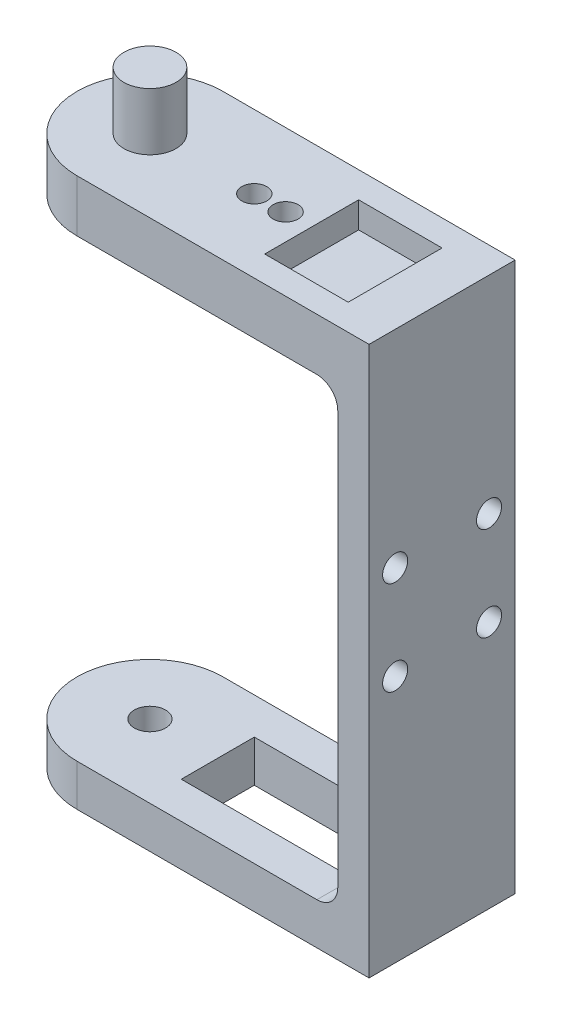
ISO-10303-21;
HEADER;
FILE_DESCRIPTION(('STEP AP214'),'2;1');
FILE_NAME('part.step','',(''),(''),'','','');
FILE_SCHEMA(('AUTOMOTIVE_DESIGN { 1 0 10303 214 1 1 1 1 }'));
ENDSEC;
DATA;
#1=APPLICATION_CONTEXT('core data for automotive mechanical design processes');
#2=APPLICATION_PROTOCOL_DEFINITION('international standard','automotive_design',2000,#1);
#3=PRODUCT_CONTEXT('',#1,'mechanical');
#4=PRODUCT('Part','Part','',(#3));
#5=PRODUCT_RELATED_PRODUCT_CATEGORY('part','',(#4));
#6=PRODUCT_DEFINITION_FORMATION('','',#4);
#7=PRODUCT_DEFINITION_CONTEXT('part definition',#1,'design');
#8=PRODUCT_DEFINITION('design','',#6,#7);
#9=PRODUCT_DEFINITION_SHAPE('','',#8);
#10=(LENGTH_UNIT() NAMED_UNIT(*) SI_UNIT(.MILLI.,.METRE.));
#11=(NAMED_UNIT(*) PLANE_ANGLE_UNIT() SI_UNIT($,.RADIAN.));
#12=(NAMED_UNIT(*) SI_UNIT($,.STERADIAN.) SOLID_ANGLE_UNIT());
#13=UNCERTAINTY_MEASURE_WITH_UNIT(LENGTH_MEASURE(1.E-05),#10,'distance_accuracy_value','');
#14=(GEOMETRIC_REPRESENTATION_CONTEXT(3) GLOBAL_UNCERTAINTY_ASSIGNED_CONTEXT((#13)) GLOBAL_UNIT_ASSIGNED_CONTEXT((#10,
#11,#12)) REPRESENTATION_CONTEXT('',''));
#15=CARTESIAN_POINT('',(0.,0.,0.));
#16=DIRECTION('',(0.,0.,1.));
#17=DIRECTION('',(1.,0.,0.));
#18=AXIS2_PLACEMENT_3D('',#15,#16,#17);
#19=CARTESIAN_POINT('',(30.5,-28.3,7.));
#20=DIRECTION('',(0.,1.,0.));
#21=DIRECTION('',(0.,0.,1.));
#22=AXIS2_PLACEMENT_3D('',#19,#20,#21);
#23=PLANE('',#22);
#24=DIRECTION('',(1.,0.,0.));
#25=VECTOR('',#24,1.);
#26=CARTESIAN_POINT('',(30.5,-28.3,-7.));
#27=LINE('',#26,#25);
#28=CARTESIAN_POINT('',(5.5,-28.3,-7.));
#29=VERTEX_POINT('',#28);
#30=CARTESIAN_POINT('',(33.5,-28.3,-7.));
#31=VERTEX_POINT('',#30);
#32=EDGE_CURVE('E405',#29,#31,#27,.T.);
#33=ORIENTED_EDGE('',*,*,#32,.T.);
#34=DIRECTION('',(0.,0.,-1.));
#35=VECTOR('',#34,1.);
#36=CARTESIAN_POINT('',(33.5,-28.3,7.));
#37=LINE('',#36,#35);
#38=CARTESIAN_POINT('',(33.5,-28.3,7.));
#39=VERTEX_POINT('',#38);
#40=EDGE_CURVE('E409',#39,#31,#37,.T.);
#41=ORIENTED_EDGE('',*,*,#40,.F.);
#42=DIRECTION('',(1.,0.,0.));
#43=VECTOR('',#42,1.);
#44=CARTESIAN_POINT('',(30.5,-28.3,7.));
#45=LINE('',#44,#43);
#46=CARTESIAN_POINT('',(5.5,-28.3,7.));
#47=VERTEX_POINT('',#46);
#48=EDGE_CURVE('E404',#47,#39,#45,.T.);
#49=ORIENTED_EDGE('',*,*,#48,.F.);
#50=CARTESIAN_POINT('',(5.5,-28.3,0.));
#51=DIRECTION('',(0.,1.,0.));
#52=DIRECTION('',(0.,0.,1.));
#53=AXIS2_PLACEMENT_3D('',#50,#51,#52);
#54=CIRCLE('',#53,7.);
#55=EDGE_CURVE('E373',#29,#47,#54,.T.);
#56=ORIENTED_EDGE('',*,*,#55,.F.);
#57=EDGE_LOOP('',(#33,#41,#49,#56));
#58=FACE_BOUND('',#57,.T.);
#59=CARTESIAN_POINT('',(5.5,-28.3,0.));
#60=DIRECTION('',(0.,1.,0.));
#61=DIRECTION('',(0.,0.,1.));
#62=AXIS2_PLACEMENT_3D('',#59,#60,#61);
#63=CIRCLE('',#62,1.5);
#64=CARTESIAN_POINT('',(5.5,-28.3,1.5));
#65=VERTEX_POINT('',#64);
#66=EDGE_CURVE('E314',#65,#65,#63,.T.);
#67=ORIENTED_EDGE('',*,*,#66,.T.);
#68=EDGE_LOOP('',(#67));
#69=FACE_BOUND('',#68,.T.);
#70=DIRECTION('',(0.,0.,1.));
#71=VECTOR('',#70,1.);
#72=CARTESIAN_POINT('',(12.,-28.3,3.5));
#73=LINE('',#72,#71);
#74=CARTESIAN_POINT('',(12.,-28.3,-3.5));
#75=VERTEX_POINT('',#74);
#76=CARTESIAN_POINT('',(12.,-28.3,3.5));
#77=VERTEX_POINT('',#76);
#78=EDGE_CURVE('E63',#75,#77,#73,.T.);
#79=ORIENTED_EDGE('',*,*,#78,.T.);
#80=DIRECTION('',(1.,0.,0.));
#81=VECTOR('',#80,1.);
#82=CARTESIAN_POINT('',(12.,-28.3,3.5));
#83=LINE('',#82,#81);
#84=CARTESIAN_POINT('',(27.,-28.3,3.5));
#85=VERTEX_POINT('',#84);
#86=EDGE_CURVE('E257',#77,#85,#83,.T.);
#87=ORIENTED_EDGE('',*,*,#86,.T.);
#88=DIRECTION('',(0.,0.,-1.));
#89=VECTOR('',#88,1.);
#90=CARTESIAN_POINT('',(27.,-28.3,3.5));
#91=LINE('',#90,#89);
#92=CARTESIAN_POINT('',(27.,-28.3,-3.5));
#93=VERTEX_POINT('',#92);
#94=EDGE_CURVE('E261',#85,#93,#91,.T.);
#95=ORIENTED_EDGE('',*,*,#94,.T.);
#96=DIRECTION('',(-1.,0.,0.));
#97=VECTOR('',#96,1.);
#98=CARTESIAN_POINT('',(12.,-28.3,-3.5));
#99=LINE('',#98,#97);
#100=EDGE_CURVE('E244',#93,#75,#99,.T.);
#101=ORIENTED_EDGE('',*,*,#100,.T.);
#102=EDGE_LOOP('',(#79,#87,#95,#101));
#103=FACE_BOUND('',#102,.T.);
#104=ADVANCED_FACE('F39',(#58,#69,#103),#23,.F.);
#105=CARTESIAN_POINT('',(5.5,-24.3,0.));
#106=DIRECTION('',(0.,1.,0.));
#107=DIRECTION('',(0.,0.,1.));
#108=AXIS2_PLACEMENT_3D('',#105,#106,#107);
#109=PLANE('',#108);
#110=CARTESIAN_POINT('',(5.5,-24.3,0.));
#111=DIRECTION('',(0.,1.,0.));
#112=DIRECTION('',(0.,0.,1.));
#113=AXIS2_PLACEMENT_3D('',#110,#111,#112);
#114=CIRCLE('',#113,1.5);
#115=CARTESIAN_POINT('',(5.5,-24.3,1.5));
#116=VERTEX_POINT('',#115);
#117=EDGE_CURVE('E309',#116,#116,#114,.T.);
#118=ORIENTED_EDGE('',*,*,#117,.F.);
#119=EDGE_LOOP('',(#118));
#120=FACE_BOUND('',#119,.T.);
#121=DIRECTION('',(1.,0.,0.));
#122=VECTOR('',#121,1.);
#123=CARTESIAN_POINT('',(5.5,-24.3,7.));
#124=LINE('',#123,#122);
#125=CARTESIAN_POINT('',(5.5,-24.3,7.));
#126=VERTEX_POINT('',#125);
#127=CARTESIAN_POINT('',(28.5,-24.3,7.));
#128=VERTEX_POINT('',#127);
#129=EDGE_CURVE('E381',#126,#128,#124,.T.);
#130=ORIENTED_EDGE('',*,*,#129,.T.);
#131=DIRECTION('',(0.,0.,1.));
#132=VECTOR('',#131,1.);
#133=CARTESIAN_POINT('',(28.5,-24.3,0.));
#134=LINE('',#133,#132);
#135=CARTESIAN_POINT('',(28.5,-24.3,-7.));
#136=VERTEX_POINT('',#135);
#137=EDGE_CURVE('E483',#128,#136,#134,.F.);
#138=ORIENTED_EDGE('',*,*,#137,.T.);
#139=DIRECTION('',(-1.,0.,0.));
#140=VECTOR('',#139,1.);
#141=CARTESIAN_POINT('',(33.5,-24.3,-7.));
#142=LINE('',#141,#140);
#143=CARTESIAN_POINT('',(5.5,-24.3,-7.));
#144=VERTEX_POINT('',#143);
#145=EDGE_CURVE('E385',#136,#144,#142,.T.);
#146=ORIENTED_EDGE('',*,*,#145,.T.);
#147=CARTESIAN_POINT('',(5.5,-24.3,0.));
#148=DIRECTION('',(0.,1.,0.));
#149=DIRECTION('',(0.,0.,1.));
#150=AXIS2_PLACEMENT_3D('',#147,#148,#149);
#151=CIRCLE('',#150,7.);
#152=EDGE_CURVE('E377',#144,#126,#151,.T.);
#153=ORIENTED_EDGE('',*,*,#152,.T.);
#154=EDGE_LOOP('',(#130,#138,#146,#153));
#155=FACE_BOUND('',#154,.T.);
#156=DIRECTION('',(1.,0.,0.));
#157=VECTOR('',#156,1.);
#158=CARTESIAN_POINT('',(12.,-24.3,3.5));
#159=LINE('',#158,#157);
#160=CARTESIAN_POINT('',(12.,-24.3,3.5));
#161=VERTEX_POINT('',#160);
#162=CARTESIAN_POINT('',(27.,-24.3,3.5));
#163=VERTEX_POINT('',#162);
#164=EDGE_CURVE('E243',#161,#163,#159,.T.);
#165=ORIENTED_EDGE('',*,*,#164,.F.);
#166=DIRECTION('',(0.,0.,1.));
#167=VECTOR('',#166,1.);
#168=CARTESIAN_POINT('',(12.,-24.3,3.5));
#169=LINE('',#168,#167);
#170=CARTESIAN_POINT('',(12.,-24.3,-3.5));
#171=VERTEX_POINT('',#170);
#172=EDGE_CURVE('E240',#171,#161,#169,.T.);
#173=ORIENTED_EDGE('',*,*,#172,.F.);
#174=DIRECTION('',(-1.,0.,0.));
#175=VECTOR('',#174,1.);
#176=CARTESIAN_POINT('',(12.,-24.3,-3.5));
#177=LINE('',#176,#175);
#178=CARTESIAN_POINT('',(27.,-24.3,-3.5));
#179=VERTEX_POINT('',#178);
#180=EDGE_CURVE('E251',#179,#171,#177,.T.);
#181=ORIENTED_EDGE('',*,*,#180,.F.);
#182=DIRECTION('',(0.,0.,-1.));
#183=VECTOR('',#182,1.);
#184=CARTESIAN_POINT('',(27.,-24.3,3.5));
#185=LINE('',#184,#183);
#186=EDGE_CURVE('E247',#163,#179,#185,.T.);
#187=ORIENTED_EDGE('',*,*,#186,.F.);
#188=EDGE_LOOP('',(#165,#173,#181,#187));
#189=FACE_BOUND('',#188,.T.);
#190=ADVANCED_FACE('F519',(#120,#155,#189),#109,.T.);
#191=CARTESIAN_POINT('',(5.5,19.3,0.));
#192=DIRECTION('',(0.,1.,0.));
#193=DIRECTION('',(0.,0.,1.));
#194=AXIS2_PLACEMENT_3D('',#191,#192,#193);
#195=PLANE('',#194);
#196=DIRECTION('',(-1.,0.,0.));
#197=VECTOR('',#196,1.);
#198=CARTESIAN_POINT('',(33.5,19.3,-7.));
#199=LINE('',#198,#197);
#200=CARTESIAN_POINT('',(28.5,19.3,-7.));
#201=VERTEX_POINT('',#200);
#202=CARTESIAN_POINT('',(5.5,19.3,-7.));
#203=VERTEX_POINT('',#202);
#204=EDGE_CURVE('E425',#201,#203,#199,.T.);
#205=ORIENTED_EDGE('',*,*,#204,.F.);
#206=DIRECTION('',(0.,0.,-1.));
#207=VECTOR('',#206,1.);
#208=CARTESIAN_POINT('',(28.5,19.3,7.));
#209=LINE('',#208,#207);
#210=CARTESIAN_POINT('',(28.5,19.3,7.));
#211=VERTEX_POINT('',#210);
#212=EDGE_CURVE('E486',#201,#211,#209,.F.);
#213=ORIENTED_EDGE('',*,*,#212,.T.);
#214=DIRECTION('',(1.,0.,0.));
#215=VECTOR('',#214,1.);
#216=CARTESIAN_POINT('',(5.5,19.3,7.));
#217=LINE('',#216,#215);
#218=CARTESIAN_POINT('',(5.5,19.3,7.));
#219=VERTEX_POINT('',#218);
#220=EDGE_CURVE('E438',#219,#211,#217,.T.);
#221=ORIENTED_EDGE('',*,*,#220,.F.);
#222=CARTESIAN_POINT('',(5.5,19.3,0.));
#223=DIRECTION('',(0.,1.,0.));
#224=DIRECTION('',(0.,0.,1.));
#225=AXIS2_PLACEMENT_3D('',#222,#223,#224);
#226=CIRCLE('',#225,7.);
#227=EDGE_CURVE('E419',#203,#219,#226,.T.);
#228=ORIENTED_EDGE('',*,*,#227,.F.);
#229=EDGE_LOOP('',(#205,#213,#221,#228));
#230=FACE_BOUND('',#229,.T.);
#231=DIRECTION('',(1.,0.,0.));
#232=VECTOR('',#231,1.);
#233=CARTESIAN_POINT('',(5.5,19.3,2.7));
#234=LINE('',#233,#232);
#235=CARTESIAN_POINT('',(8.0298221281347,19.3,2.7));
#236=VERTEX_POINT('',#235);
#237=CARTESIAN_POINT('',(20.7,19.3,2.7));
#238=VERTEX_POINT('',#237);
#239=EDGE_CURVE('E322',#236,#238,#234,.T.);
#240=ORIENTED_EDGE('',*,*,#239,.T.);
#241=DIRECTION('',(0.,0.,-1.));
#242=VECTOR('',#241,1.);
#243=CARTESIAN_POINT('',(20.7,19.3,2.7));
#244=LINE('',#243,#242);
#245=CARTESIAN_POINT('',(20.7,19.3,-2.7));
#246=VERTEX_POINT('',#245);
#247=EDGE_CURVE('E340',#238,#246,#244,.T.);
#248=ORIENTED_EDGE('',*,*,#247,.T.);
#249=DIRECTION('',(-1.,0.,0.));
#250=VECTOR('',#249,1.);
#251=CARTESIAN_POINT('',(20.7,19.3,-2.7));
#252=LINE('',#251,#250);
#253=CARTESIAN_POINT('',(8.0298221281347,19.3,-2.7));
#254=VERTEX_POINT('',#253);
#255=EDGE_CURVE('E330',#246,#254,#252,.T.);
#256=ORIENTED_EDGE('',*,*,#255,.T.);
#257=CARTESIAN_POINT('',(5.5,19.3,0.));
#258=DIRECTION('',(0.,1.,0.));
#259=DIRECTION('',(0.,0.,1.));
#260=AXIS2_PLACEMENT_3D('',#257,#258,#259);
#261=CIRCLE('',#260,3.7);
#262=EDGE_CURVE('E360',#254,#236,#261,.T.);
#263=ORIENTED_EDGE('',*,*,#262,.T.);
#264=EDGE_LOOP('',(#240,#248,#256,#263));
#265=FACE_BOUND('',#264,.T.);
#266=ADVANCED_FACE('F505',(#230,#265),#195,.F.);
#267=CARTESIAN_POINT('',(5.5,20.9,0.));
#268=DIRECTION('',(0.,-1.,0.));
#269=DIRECTION('',(0.,0.,-1.));
#270=AXIS2_PLACEMENT_3D('',#267,#268,#269);
#271=CYLINDRICAL_SURFACE('',#270,3.7);
#272=CARTESIAN_POINT('',(5.5,20.9,0.));
#273=DIRECTION('',(0.,1.,0.));
#274=DIRECTION('',(0.,0.,1.));
#275=AXIS2_PLACEMENT_3D('',#272,#273,#274);
#276=CIRCLE('',#275,3.7);
#277=CARTESIAN_POINT('',(8.02982212813471,20.9,-2.7));
#278=VERTEX_POINT('',#277);
#279=CARTESIAN_POINT('',(8.0298221281347,20.9,2.7));
#280=VERTEX_POINT('',#279);
#281=EDGE_CURVE('E361',#278,#280,#276,.T.);
#282=ORIENTED_EDGE('',*,*,#281,.T.);
#283=DIRECTION('',(0.,-1.,0.));
#284=VECTOR('',#283,1.);
#285=CARTESIAN_POINT('',(8.02982212813471,20.9,2.7));
#286=LINE('',#285,#284);
#287=EDGE_CURVE('E356',#280,#236,#286,.T.);
#288=ORIENTED_EDGE('',*,*,#287,.T.);
#289=ORIENTED_EDGE('',*,*,#262,.F.);
#290=DIRECTION('',(0.,-1.,0.));
#291=VECTOR('',#290,1.);
#292=CARTESIAN_POINT('',(8.02982212813471,20.9,-2.7));
#293=LINE('',#292,#291);
#294=EDGE_CURVE('E352',#254,#278,#293,.F.);
#295=ORIENTED_EDGE('',*,*,#294,.T.);
#296=EDGE_LOOP('',(#282,#288,#289,#295));
#297=FACE_BOUND('',#296,.T.);
#298=ADVANCED_FACE('F544',(#297),#271,.F.);
#299=CARTESIAN_POINT('',(5.5,24.3,0.));
#300=DIRECTION('',(0.,-1.,0.));
#301=DIRECTION('',(0.,0.,-1.));
#302=AXIS2_PLACEMENT_3D('',#299,#300,#301);
#303=CYLINDRICAL_SURFACE('',#302,7.);
#304=ORIENTED_EDGE('',*,*,#227,.T.);
#305=DIRECTION('',(0.,-1.,0.));
#306=VECTOR('',#305,1.);
#307=CARTESIAN_POINT('',(5.5,24.3,7.));
#308=LINE('',#307,#306);
#309=CARTESIAN_POINT('',(5.5,24.3,7.));
#310=VERTEX_POINT('',#309);
#311=EDGE_CURVE('E453',#310,#219,#308,.T.);
#312=ORIENTED_EDGE('',*,*,#311,.F.);
#313=CARTESIAN_POINT('',(5.5,24.3,0.));
#314=DIRECTION('',(0.,1.,0.));
#315=DIRECTION('',(0.,0.,1.));
#316=AXIS2_PLACEMENT_3D('',#313,#314,#315);
#317=CIRCLE('',#316,7.);
#318=CARTESIAN_POINT('',(5.5,24.3,-7.));
#319=VERTEX_POINT('',#318);
#320=EDGE_CURVE('E420',#319,#310,#317,.T.);
#321=ORIENTED_EDGE('',*,*,#320,.F.);
#322=DIRECTION('',(0.,-1.,0.));
#323=VECTOR('',#322,1.);
#324=CARTESIAN_POINT('',(5.5,24.3,-7.));
#325=LINE('',#324,#323);
#326=EDGE_CURVE('E434',#319,#203,#325,.T.);
#327=ORIENTED_EDGE('',*,*,#326,.T.);
#328=EDGE_LOOP('',(#304,#312,#321,#327));
#329=FACE_BOUND('',#328,.T.);
#330=ADVANCED_FACE('F542',(#329),#303,.T.);
#331=CARTESIAN_POINT('',(5.5,24.3,7.));
#332=DIRECTION('',(0.,0.,-1.));
#333=DIRECTION('',(-1.,0.,0.));
#334=AXIS2_PLACEMENT_3D('',#331,#332,#333);
#335=PLANE('',#334);
#336=ORIENTED_EDGE('',*,*,#220,.T.);
#337=CARTESIAN_POINT('',(28.5,17.3,7.));
#338=DIRECTION('',(0.,0.,-1.));
#339=DIRECTION('',(-1.,0.,0.));
#340=AXIS2_PLACEMENT_3D('',#337,#338,#339);
#341=CIRCLE('',#340,2.);
#342=CARTESIAN_POINT('',(30.5,17.3,7.));
#343=VERTEX_POINT('',#342);
#344=EDGE_CURVE('E11',#211,#343,#341,.T.);
#345=ORIENTED_EDGE('',*,*,#344,.T.);
#346=DIRECTION('',(0.,-1.,0.));
#347=VECTOR('',#346,1.);
#348=CARTESIAN_POINT('',(30.5,-28.3,7.));
#349=LINE('',#348,#347);
#350=CARTESIAN_POINT('',(30.5,-22.3,7.));
#351=VERTEX_POINT('',#350);
#352=EDGE_CURVE('E400',#343,#351,#349,.T.);
#353=ORIENTED_EDGE('',*,*,#352,.T.);
#354=CARTESIAN_POINT('',(28.5,-22.3,7.));
#355=DIRECTION('',(0.,0.,-1.));
#356=DIRECTION('',(-1.,0.,0.));
#357=AXIS2_PLACEMENT_3D('',#354,#355,#356);
#358=CIRCLE('',#357,2.);
#359=EDGE_CURVE('E489',#351,#128,#358,.T.);
#360=ORIENTED_EDGE('',*,*,#359,.T.);
#361=ORIENTED_EDGE('',*,*,#129,.F.);
#362=DIRECTION('',(0.,-1.,0.));
#363=VECTOR('',#362,1.);
#364=CARTESIAN_POINT('',(5.5,-24.3,7.));
#365=LINE('',#364,#363);
#366=EDGE_CURVE('E395',#126,#47,#365,.T.);
#367=ORIENTED_EDGE('',*,*,#366,.T.);
#368=ORIENTED_EDGE('',*,*,#48,.T.);
#369=DIRECTION('',(0.,-1.,0.));
#370=VECTOR('',#369,1.);
#371=CARTESIAN_POINT('',(33.5,24.3,7.));
#372=LINE('',#371,#370);
#373=CARTESIAN_POINT('',(33.5,24.3,7.));
#374=VERTEX_POINT('',#373);
#375=EDGE_CURVE('E450',#374,#39,#372,.T.);
#376=ORIENTED_EDGE('',*,*,#375,.F.);
#377=DIRECTION('',(1.,0.,0.));
#378=VECTOR('',#377,1.);
#379=CARTESIAN_POINT('',(5.5,24.3,7.));
#380=LINE('',#379,#378);
#381=EDGE_CURVE('E424',#310,#374,#380,.T.);
#382=ORIENTED_EDGE('',*,*,#381,.F.);
#383=ORIENTED_EDGE('',*,*,#311,.T.);
#384=EDGE_LOOP('',(#336,#345,#353,#360,#361,#367,#368,#376,#382,#383));
#385=FACE_BOUND('',#384,.T.);
#386=ADVANCED_FACE('F510',(#385),#335,.F.);
#387=CARTESIAN_POINT('',(33.5,24.3,7.));
#388=DIRECTION('',(-1.,0.,0.));
#389=DIRECTION('',(0.,0.,1.));
#390=AXIS2_PLACEMENT_3D('',#387,#388,#389);
#391=PLANE('',#390);
#392=CARTESIAN_POINT('',(33.5,4.5,4.5));
#393=DIRECTION('',(1.,0.,0.));
#394=DIRECTION('',(0.,0.,-1.));
#395=AXIS2_PLACEMENT_3D('',#392,#393,#394);
#396=CIRCLE('',#395,1.19999999999999);
#397=CARTESIAN_POINT('',(33.5,4.5,3.30000000000001));
#398=VERTEX_POINT('',#397);
#399=EDGE_CURVE('E279',#398,#398,#396,.T.);
#400=ORIENTED_EDGE('',*,*,#399,.F.);
#401=EDGE_LOOP('',(#400));
#402=FACE_BOUND('',#401,.T.);
#403=CARTESIAN_POINT('',(33.5,4.5,-4.5));
#404=DIRECTION('',(1.,0.,0.));
#405=DIRECTION('',(0.,0.,-1.));
#406=AXIS2_PLACEMENT_3D('',#403,#404,#405);
#407=CIRCLE('',#406,1.19999999999999);
#408=CARTESIAN_POINT('',(33.5,4.5,-5.69999999999999));
#409=VERTEX_POINT('',#408);
#410=EDGE_CURVE('E284',#409,#409,#407,.T.);
#411=ORIENTED_EDGE('',*,*,#410,.F.);
#412=EDGE_LOOP('',(#411));
#413=FACE_BOUND('',#412,.T.);
#414=CARTESIAN_POINT('',(33.5,-4.5,4.5));
#415=DIRECTION('',(1.,0.,0.));
#416=DIRECTION('',(0.,0.,-1.));
#417=AXIS2_PLACEMENT_3D('',#414,#415,#416);
#418=CIRCLE('',#417,1.19999999999999);
#419=CARTESIAN_POINT('',(33.5,-4.5,3.30000000000001));
#420=VERTEX_POINT('',#419);
#421=EDGE_CURVE('E289',#420,#420,#418,.T.);
#422=ORIENTED_EDGE('',*,*,#421,.F.);
#423=EDGE_LOOP('',(#422));
#424=FACE_BOUND('',#423,.T.);
#425=CARTESIAN_POINT('',(33.5,-4.5,-4.5));
#426=DIRECTION('',(1.,0.,0.));
#427=DIRECTION('',(0.,0.,-1.));
#428=AXIS2_PLACEMENT_3D('',#425,#426,#427);
#429=CIRCLE('',#428,1.19999999999999);
#430=CARTESIAN_POINT('',(33.5,-4.5,-5.69999999999999));
#431=VERTEX_POINT('',#430);
#432=EDGE_CURVE('E294',#431,#431,#429,.T.);
#433=ORIENTED_EDGE('',*,*,#432,.F.);
#434=EDGE_LOOP('',(#433));
#435=FACE_BOUND('',#434,.T.);
#436=ORIENTED_EDGE('',*,*,#375,.T.);
#437=ORIENTED_EDGE('',*,*,#40,.T.);
#438=DIRECTION('',(0.,-1.,0.));
#439=VECTOR('',#438,1.);
#440=CARTESIAN_POINT('',(33.5,24.3,-7.));
#441=LINE('',#440,#439);
#442=CARTESIAN_POINT('',(33.5,24.3,-7.));
#443=VERTEX_POINT('',#442);
#444=EDGE_CURVE('E447',#443,#31,#441,.T.);
#445=ORIENTED_EDGE('',*,*,#444,.F.);
#446=DIRECTION('',(0.,0.,-1.));
#447=VECTOR('',#446,1.);
#448=CARTESIAN_POINT('',(33.5,24.3,7.));
#449=LINE('',#448,#447);
#450=EDGE_CURVE('E428',#374,#443,#449,.T.);
#451=ORIENTED_EDGE('',*,*,#450,.F.);
#452=EDGE_LOOP('',(#436,#437,#445,#451));
#453=FACE_BOUND('',#452,.T.);
#454=ADVANCED_FACE('F535',(#402,#413,#424,#435,#453),#391,.F.);
#455=CARTESIAN_POINT('',(33.5,24.3,-7.));
#456=DIRECTION('',(0.,0.,1.));
#457=DIRECTION('',(1.,0.,0.));
#458=AXIS2_PLACEMENT_3D('',#455,#456,#457);
#459=PLANE('',#458);
#460=ORIENTED_EDGE('',*,*,#444,.T.);
#461=ORIENTED_EDGE('',*,*,#32,.F.);
#462=DIRECTION('',(0.,-1.,0.));
#463=VECTOR('',#462,1.);
#464=CARTESIAN_POINT('',(5.5,-24.3,-7.));
#465=LINE('',#464,#463);
#466=EDGE_CURVE('E388',#144,#29,#465,.T.);
#467=ORIENTED_EDGE('',*,*,#466,.F.);
#468=ORIENTED_EDGE('',*,*,#145,.F.);
#469=CARTESIAN_POINT('',(28.5,-22.3,-7.));
#470=DIRECTION('',(0.,0.,1.));
#471=DIRECTION('',(1.,0.,0.));
#472=AXIS2_PLACEMENT_3D('',#469,#470,#471);
#473=CIRCLE('',#472,2.);
#474=CARTESIAN_POINT('',(30.5,-22.3,-7.));
#475=VERTEX_POINT('',#474);
#476=EDGE_CURVE('E492',#136,#475,#473,.T.);
#477=ORIENTED_EDGE('',*,*,#476,.T.);
#478=DIRECTION('',(0.,-1.,0.));
#479=VECTOR('',#478,1.);
#480=CARTESIAN_POINT('',(30.5,-28.3,-7.));
#481=LINE('',#480,#479);
#482=CARTESIAN_POINT('',(30.5,17.3,-7.));
#483=VERTEX_POINT('',#482);
#484=EDGE_CURVE('E399',#483,#475,#481,.T.);
#485=ORIENTED_EDGE('',*,*,#484,.F.);
#486=CARTESIAN_POINT('',(28.5,17.3,-7.));
#487=DIRECTION('',(0.,0.,1.));
#488=DIRECTION('',(1.,0.,0.));
#489=AXIS2_PLACEMENT_3D('',#486,#487,#488);
#490=CIRCLE('',#489,2.);
#491=EDGE_CURVE('E48',#483,#201,#490,.T.);
#492=ORIENTED_EDGE('',*,*,#491,.T.);
#493=ORIENTED_EDGE('',*,*,#204,.T.);
#494=ORIENTED_EDGE('',*,*,#326,.F.);
#495=DIRECTION('',(-1.,0.,0.));
#496=VECTOR('',#495,1.);
#497=CARTESIAN_POINT('',(33.5,24.3,-7.));
#498=LINE('',#497,#496);
#499=EDGE_CURVE('E431',#443,#319,#498,.T.);
#500=ORIENTED_EDGE('',*,*,#499,.F.);
#501=EDGE_LOOP('',(#460,#461,#467,#468,#477,#485,#492,#493,#494,#500));
#502=FACE_BOUND('',#501,.T.);
#503=ADVANCED_FACE('F498',(#502),#459,.F.);
#504=CARTESIAN_POINT('',(5.5,24.3,0.));
#505=DIRECTION('',(0.,1.,0.));
#506=DIRECTION('',(0.,0.,1.));
#507=AXIS2_PLACEMENT_3D('',#504,#505,#506);
#508=PLANE('',#507);
#509=DIRECTION('',(0.,0.,1.));
#510=VECTOR('',#509,1.);
#511=CARTESIAN_POINT('',(21.,24.3,4.5));
#512=LINE('',#511,#510);
#513=CARTESIAN_POINT('',(21.,24.3,-4.5));
#514=VERTEX_POINT('',#513);
#515=CARTESIAN_POINT('',(21.,24.3,4.5));
#516=VERTEX_POINT('',#515);
#517=EDGE_CURVE('E55',#514,#516,#512,.T.);
#518=ORIENTED_EDGE('',*,*,#517,.F.);
#519=DIRECTION('',(-1.,0.,0.));
#520=VECTOR('',#519,1.);
#521=CARTESIAN_POINT('',(21.,24.3,-4.5));
#522=LINE('',#521,#520);
#523=CARTESIAN_POINT('',(29.,24.3,-4.5));
#524=VERTEX_POINT('',#523);
#525=EDGE_CURVE('E213',#524,#514,#522,.T.);
#526=ORIENTED_EDGE('',*,*,#525,.F.);
#527=DIRECTION('',(0.,0.,-1.));
#528=VECTOR('',#527,1.);
#529=CARTESIAN_POINT('',(29.,24.3,4.5));
#530=LINE('',#529,#528);
#531=CARTESIAN_POINT('',(29.,24.3,4.5));
#532=VERTEX_POINT('',#531);
#533=EDGE_CURVE('E217',#532,#524,#530,.T.);
#534=ORIENTED_EDGE('',*,*,#533,.F.);
#535=DIRECTION('',(1.,0.,0.));
#536=VECTOR('',#535,1.);
#537=CARTESIAN_POINT('',(21.,24.3,4.5));
#538=LINE('',#537,#536);
#539=EDGE_CURVE('E226',#516,#532,#538,.T.);
#540=ORIENTED_EDGE('',*,*,#539,.F.);
#541=EDGE_LOOP('',(#518,#526,#534,#540));
#542=FACE_BOUND('',#541,.T.);
#543=CARTESIAN_POINT('',(18.5,24.3,0.));
#544=DIRECTION('',(0.,1.,0.));
#545=DIRECTION('',(0.,0.,1.));
#546=AXIS2_PLACEMENT_3D('',#543,#544,#545);
#547=CIRCLE('',#546,1.19999999999999);
#548=CARTESIAN_POINT('',(18.5,24.3,1.19999999999999));
#549=VERTEX_POINT('',#548);
#550=EDGE_CURVE('E299',#549,#549,#547,.T.);
#551=ORIENTED_EDGE('',*,*,#550,.F.);
#552=EDGE_LOOP('',(#551));
#553=FACE_BOUND('',#552,.T.);
#554=CARTESIAN_POINT('',(15.5,24.3,0.));
#555=DIRECTION('',(0.,1.,0.));
#556=DIRECTION('',(0.,0.,1.));
#557=AXIS2_PLACEMENT_3D('',#554,#555,#556);
#558=CIRCLE('',#557,1.19999999999999);
#559=CARTESIAN_POINT('',(15.5,24.3,1.19999999999999));
#560=VERTEX_POINT('',#559);
#561=EDGE_CURVE('E304',#560,#560,#558,.T.);
#562=ORIENTED_EDGE('',*,*,#561,.F.);
#563=EDGE_LOOP('',(#562));
#564=FACE_BOUND('',#563,.T.);
#565=CARTESIAN_POINT('',(5.5,24.3,0.));
#566=DIRECTION('',(0.,1.,0.));
#567=DIRECTION('',(0.,0.,1.));
#568=AXIS2_PLACEMENT_3D('',#565,#566,#567);
#569=CIRCLE('',#568,2.5);
#570=CARTESIAN_POINT('',(5.5,24.3,2.5));
#571=VERTEX_POINT('',#570);
#572=EDGE_CURVE('E365',#571,#571,#569,.T.);
#573=ORIENTED_EDGE('',*,*,#572,.F.);
#574=EDGE_LOOP('',(#573));
#575=FACE_BOUND('',#574,.T.);
#576=ORIENTED_EDGE('',*,*,#499,.T.);
#577=ORIENTED_EDGE('',*,*,#320,.T.);
#578=ORIENTED_EDGE('',*,*,#381,.T.);
#579=ORIENTED_EDGE('',*,*,#450,.T.);
#580=EDGE_LOOP('',(#576,#577,#578,#579));
#581=FACE_BOUND('',#580,.T.);
#582=ADVANCED_FACE('F538',(#542,#553,#564,#575,#581),#508,.T.);
#583=CARTESIAN_POINT('',(30.5,-28.3,7.));
#584=DIRECTION('',(1.,0.,0.));
#585=DIRECTION('',(0.,0.,-1.));
#586=AXIS2_PLACEMENT_3D('',#583,#584,#585);
#587=PLANE('',#586);
#588=CARTESIAN_POINT('',(30.5,4.5,4.5));
#589=DIRECTION('',(1.,0.,0.));
#590=DIRECTION('',(0.,0.,-1.));
#591=AXIS2_PLACEMENT_3D('',#588,#589,#590);
#592=CIRCLE('',#591,1.19999999999999);
#593=CARTESIAN_POINT('',(30.5,4.5,3.30000000000001));
#594=VERTEX_POINT('',#593);
#595=EDGE_CURVE('E283',#594,#594,#592,.T.);
#596=ORIENTED_EDGE('',*,*,#595,.T.);
#597=EDGE_LOOP('',(#596));
#598=FACE_BOUND('',#597,.T.);
#599=CARTESIAN_POINT('',(30.5,4.5,-4.5));
#600=DIRECTION('',(1.,0.,0.));
#601=DIRECTION('',(0.,0.,-1.));
#602=AXIS2_PLACEMENT_3D('',#599,#600,#601);
#603=CIRCLE('',#602,1.19999999999999);
#604=CARTESIAN_POINT('',(30.5,4.5,-5.69999999999998));
#605=VERTEX_POINT('',#604);
#606=EDGE_CURVE('E288',#605,#605,#603,.T.);
#607=ORIENTED_EDGE('',*,*,#606,.T.);
#608=EDGE_LOOP('',(#607));
#609=FACE_BOUND('',#608,.T.);
#610=CARTESIAN_POINT('',(30.5,-4.5,4.5));
#611=DIRECTION('',(1.,0.,0.));
#612=DIRECTION('',(0.,0.,-1.));
#613=AXIS2_PLACEMENT_3D('',#610,#611,#612);
#614=CIRCLE('',#613,1.19999999999999);
#615=CARTESIAN_POINT('',(30.5,-4.5,3.30000000000001));
#616=VERTEX_POINT('',#615);
#617=EDGE_CURVE('E293',#616,#616,#614,.T.);
#618=ORIENTED_EDGE('',*,*,#617,.T.);
#619=EDGE_LOOP('',(#618));
#620=FACE_BOUND('',#619,.T.);
#621=CARTESIAN_POINT('',(30.5,-4.5,-4.5));
#622=DIRECTION('',(1.,0.,0.));
#623=DIRECTION('',(0.,0.,-1.));
#624=AXIS2_PLACEMENT_3D('',#621,#622,#623);
#625=CIRCLE('',#624,1.19999999999999);
#626=CARTESIAN_POINT('',(30.5,-4.5,-5.69999999999998));
#627=VERTEX_POINT('',#626);
#628=EDGE_CURVE('E298',#627,#627,#625,.T.);
#629=ORIENTED_EDGE('',*,*,#628,.T.);
#630=EDGE_LOOP('',(#629));
#631=FACE_BOUND('',#630,.T.);
#632=ORIENTED_EDGE('',*,*,#484,.T.);
#633=DIRECTION('',(0.,0.,1.));
#634=VECTOR('',#633,1.);
#635=CARTESIAN_POINT('',(30.5,-22.3,7.));
#636=LINE('',#635,#634);
#637=EDGE_CURVE('E479',#475,#351,#636,.T.);
#638=ORIENTED_EDGE('',*,*,#637,.T.);
#639=ORIENTED_EDGE('',*,*,#352,.F.);
#640=DIRECTION('',(0.,0.,-1.));
#641=VECTOR('',#640,1.);
#642=CARTESIAN_POINT('',(30.5,17.3,-7.));
#643=LINE('',#642,#641);
#644=EDGE_CURVE('E457',#343,#483,#643,.T.);
#645=ORIENTED_EDGE('',*,*,#644,.T.);
#646=EDGE_LOOP('',(#632,#638,#639,#645));
#647=FACE_BOUND('',#646,.T.);
#648=ADVANCED_FACE('F512',(#598,#609,#620,#631,#647),#587,.F.);
#649=CARTESIAN_POINT('',(5.5,-24.3,0.));
#650=DIRECTION('',(0.,-1.,0.));
#651=DIRECTION('',(0.,0.,-1.));
#652=AXIS2_PLACEMENT_3D('',#649,#650,#651);
#653=CYLINDRICAL_SURFACE('',#652,7.);
#654=ORIENTED_EDGE('',*,*,#55,.T.);
#655=ORIENTED_EDGE('',*,*,#366,.F.);
#656=ORIENTED_EDGE('',*,*,#152,.F.);
#657=ORIENTED_EDGE('',*,*,#466,.T.);
#658=EDGE_LOOP('',(#654,#655,#656,#657));
#659=FACE_BOUND('',#658,.T.);
#660=ADVANCED_FACE('F526',(#659),#653,.T.);
#661=CARTESIAN_POINT('',(5.5,29.8,0.));
#662=DIRECTION('',(0.,-1.,0.));
#663=DIRECTION('',(0.,0.,-1.));
#664=AXIS2_PLACEMENT_3D('',#661,#662,#663);
#665=CYLINDRICAL_SURFACE('',#664,2.5);
#666=CARTESIAN_POINT('',(5.5,29.8,0.));
#667=DIRECTION('',(0.,1.,0.));
#668=DIRECTION('',(0.,0.,1.));
#669=AXIS2_PLACEMENT_3D('',#666,#667,#668);
#670=CIRCLE('',#669,2.5);
#671=CARTESIAN_POINT('',(5.5,29.8,2.5));
#672=VERTEX_POINT('',#671);
#673=EDGE_CURVE('E369',#672,#672,#670,.T.);
#674=ORIENTED_EDGE('',*,*,#673,.F.);
#675=EDGE_LOOP('',(#674));
#676=FACE_BOUND('',#675,.T.);
#677=ORIENTED_EDGE('',*,*,#572,.T.);
#678=EDGE_LOOP('',(#677));
#679=FACE_BOUND('',#678,.T.);
#680=ADVANCED_FACE('F638',(#676,#679),#665,.T.);
#681=CARTESIAN_POINT('',(5.5,29.8,0.));
#682=DIRECTION('',(0.,1.,0.));
#683=DIRECTION('',(0.,0.,1.));
#684=AXIS2_PLACEMENT_3D('',#681,#682,#683);
#685=PLANE('',#684);
#686=ORIENTED_EDGE('',*,*,#673,.T.);
#687=EDGE_LOOP('',(#686));
#688=FACE_BOUND('',#687,.T.);
#689=ADVANCED_FACE('F633',(#688),#685,.T.);
#690=CARTESIAN_POINT('',(5.5,20.9,0.));
#691=DIRECTION('',(0.,1.,0.));
#692=DIRECTION('',(0.,0.,1.));
#693=AXIS2_PLACEMENT_3D('',#690,#691,#692);
#694=PLANE('',#693);
#695=CARTESIAN_POINT('',(18.5,20.9,0.));
#696=DIRECTION('',(0.,1.,0.));
#697=DIRECTION('',(0.,0.,1.));
#698=AXIS2_PLACEMENT_3D('',#695,#696,#697);
#699=CIRCLE('',#698,1.19999999999999);
#700=CARTESIAN_POINT('',(18.5,20.9,1.19999999999999));
#701=VERTEX_POINT('',#700);
#702=EDGE_CURVE('E303',#701,#701,#699,.T.);
#703=ORIENTED_EDGE('',*,*,#702,.T.);
#704=EDGE_LOOP('',(#703));
#705=FACE_BOUND('',#704,.T.);
#706=CARTESIAN_POINT('',(15.5,20.9,0.));
#707=DIRECTION('',(0.,1.,0.));
#708=DIRECTION('',(0.,0.,1.));
#709=AXIS2_PLACEMENT_3D('',#706,#707,#708);
#710=CIRCLE('',#709,1.19999999999999);
#711=CARTESIAN_POINT('',(15.5,20.9,1.19999999999999));
#712=VERTEX_POINT('',#711);
#713=EDGE_CURVE('E308',#712,#712,#710,.T.);
#714=ORIENTED_EDGE('',*,*,#713,.T.);
#715=EDGE_LOOP('',(#714));
#716=FACE_BOUND('',#715,.T.);
#717=CARTESIAN_POINT('',(5.5,20.9,0.));
#718=DIRECTION('',(0.,1.,0.));
#719=DIRECTION('',(0.,0.,1.));
#720=AXIS2_PLACEMENT_3D('',#717,#718,#719);
#721=CIRCLE('',#720,2.5);
#722=CARTESIAN_POINT('',(5.5,20.9,2.5));
#723=VERTEX_POINT('',#722);
#724=EDGE_CURVE('E313',#723,#723,#721,.T.);
#725=ORIENTED_EDGE('',*,*,#724,.T.);
#726=EDGE_LOOP('',(#725));
#727=FACE_BOUND('',#726,.T.);
#728=ORIENTED_EDGE('',*,*,#281,.F.);
#729=DIRECTION('',(-1.,0.,0.));
#730=VECTOR('',#729,1.);
#731=CARTESIAN_POINT('',(20.7,20.9,-2.7));
#732=LINE('',#731,#730);
#733=CARTESIAN_POINT('',(20.7,20.9,-2.7));
#734=VERTEX_POINT('',#733);
#735=EDGE_CURVE('E333',#734,#278,#732,.T.);
#736=ORIENTED_EDGE('',*,*,#735,.F.);
#737=DIRECTION('',(0.,0.,-1.));
#738=VECTOR('',#737,1.);
#739=CARTESIAN_POINT('',(20.7,20.9,2.7));
#740=LINE('',#739,#738);
#741=CARTESIAN_POINT('',(20.7,20.9,2.7));
#742=VERTEX_POINT('',#741);
#743=EDGE_CURVE('E329',#742,#734,#740,.T.);
#744=ORIENTED_EDGE('',*,*,#743,.F.);
#745=DIRECTION('',(1.,0.,0.));
#746=VECTOR('',#745,1.);
#747=CARTESIAN_POINT('',(5.5,20.9,2.7));
#748=LINE('',#747,#746);
#749=EDGE_CURVE('E326',#280,#742,#748,.T.);
#750=ORIENTED_EDGE('',*,*,#749,.F.);
#751=EDGE_LOOP('',(#728,#736,#744,#750));
#752=FACE_BOUND('',#751,.T.);
#753=ADVANCED_FACE('F630',(#705,#716,#727,#752),#694,.F.);
#754=CARTESIAN_POINT('',(5.5,20.9,2.7));
#755=DIRECTION('',(0.,0.,-1.));
#756=DIRECTION('',(-1.,0.,0.));
#757=AXIS2_PLACEMENT_3D('',#754,#755,#756);
#758=PLANE('',#757);
#759=ORIENTED_EDGE('',*,*,#749,.T.);
#760=DIRECTION('',(0.,-1.,0.));
#761=VECTOR('',#760,1.);
#762=CARTESIAN_POINT('',(20.7,20.9,2.7));
#763=LINE('',#762,#761);
#764=EDGE_CURVE('E349',#742,#238,#763,.T.);
#765=ORIENTED_EDGE('',*,*,#764,.T.);
#766=ORIENTED_EDGE('',*,*,#239,.F.);
#767=ORIENTED_EDGE('',*,*,#287,.F.);
#768=EDGE_LOOP('',(#759,#765,#766,#767));
#769=FACE_BOUND('',#768,.T.);
#770=ADVANCED_FACE('F626',(#769),#758,.T.);
#771=CARTESIAN_POINT('',(20.7,20.9,2.7));
#772=DIRECTION('',(-1.,0.,0.));
#773=DIRECTION('',(0.,0.,1.));
#774=AXIS2_PLACEMENT_3D('',#771,#772,#773);
#775=PLANE('',#774);
#776=ORIENTED_EDGE('',*,*,#247,.F.);
#777=ORIENTED_EDGE('',*,*,#764,.F.);
#778=ORIENTED_EDGE('',*,*,#743,.T.);
#779=DIRECTION('',(0.,-1.,0.));
#780=VECTOR('',#779,1.);
#781=CARTESIAN_POINT('',(20.7,20.9,-2.7));
#782=LINE('',#781,#780);
#783=EDGE_CURVE('E336',#734,#246,#782,.T.);
#784=ORIENTED_EDGE('',*,*,#783,.T.);
#785=EDGE_LOOP('',(#776,#777,#778,#784));
#786=FACE_BOUND('',#785,.T.);
#787=ADVANCED_FACE('F622',(#786),#775,.T.);
#788=CARTESIAN_POINT('',(20.7,20.9,-2.7));
#789=DIRECTION('',(0.,0.,1.));
#790=DIRECTION('',(1.,0.,0.));
#791=AXIS2_PLACEMENT_3D('',#788,#789,#790);
#792=PLANE('',#791);
#793=ORIENTED_EDGE('',*,*,#255,.F.);
#794=ORIENTED_EDGE('',*,*,#783,.F.);
#795=ORIENTED_EDGE('',*,*,#735,.T.);
#796=ORIENTED_EDGE('',*,*,#294,.F.);
#797=EDGE_LOOP('',(#793,#794,#795,#796));
#798=FACE_BOUND('',#797,.T.);
#799=ADVANCED_FACE('F618',(#798),#792,.T.);
#800=CARTESIAN_POINT('',(5.5,22.5,0.));
#801=DIRECTION('',(0.,-1.,0.));
#802=DIRECTION('',(0.,0.,-1.));
#803=AXIS2_PLACEMENT_3D('',#800,#801,#802);
#804=CYLINDRICAL_SURFACE('',#803,2.5);
#805=CARTESIAN_POINT('',(5.5,22.5,0.));
#806=DIRECTION('',(0.,1.,0.));
#807=DIRECTION('',(0.,0.,1.));
#808=AXIS2_PLACEMENT_3D('',#805,#806,#807);
#809=CIRCLE('',#808,2.5);
#810=CARTESIAN_POINT('',(5.5,22.5,2.5));
#811=VERTEX_POINT('',#810);
#812=EDGE_CURVE('E318',#811,#811,#809,.T.);
#813=ORIENTED_EDGE('',*,*,#812,.T.);
#814=EDGE_LOOP('',(#813));
#815=FACE_BOUND('',#814,.T.);
#816=ORIENTED_EDGE('',*,*,#724,.F.);
#817=EDGE_LOOP('',(#816));
#818=FACE_BOUND('',#817,.T.);
#819=ADVANCED_FACE('F614',(#815,#818),#804,.F.);
#820=CARTESIAN_POINT('',(5.5,22.5,0.));
#821=DIRECTION('',(0.,1.,0.));
#822=DIRECTION('',(0.,0.,1.));
#823=AXIS2_PLACEMENT_3D('',#820,#821,#822);
#824=PLANE('',#823);
#825=ORIENTED_EDGE('',*,*,#812,.F.);
#826=EDGE_LOOP('',(#825));
#827=FACE_BOUND('',#826,.T.);
#828=ADVANCED_FACE('F610',(#827),#824,.F.);
#829=CARTESIAN_POINT('',(5.5,-24.3,0.));
#830=DIRECTION('',(0.,-1.,0.));
#831=DIRECTION('',(0.,0.,-1.));
#832=AXIS2_PLACEMENT_3D('',#829,#830,#831);
#833=CYLINDRICAL_SURFACE('',#832,1.5);
#834=ORIENTED_EDGE('',*,*,#117,.T.);
#835=EDGE_LOOP('',(#834));
#836=FACE_BOUND('',#835,.T.);
#837=ORIENTED_EDGE('',*,*,#66,.F.);
#838=EDGE_LOOP('',(#837));
#839=FACE_BOUND('',#838,.T.);
#840=ADVANCED_FACE('F606',(#836,#839),#833,.F.);
#841=CARTESIAN_POINT('',(15.5,24.3,0.));
#842=DIRECTION('',(0.,1.,0.));
#843=DIRECTION('',(0.,0.,1.));
#844=AXIS2_PLACEMENT_3D('',#841,#842,#843);
#845=CYLINDRICAL_SURFACE('',#844,1.19999999999999);
#846=ORIENTED_EDGE('',*,*,#561,.T.);
#847=EDGE_LOOP('',(#846));
#848=FACE_BOUND('',#847,.T.);
#849=ORIENTED_EDGE('',*,*,#713,.F.);
#850=EDGE_LOOP('',(#849));
#851=FACE_BOUND('',#850,.T.);
#852=ADVANCED_FACE('F599',(#848,#851),#845,.F.);
#853=CARTESIAN_POINT('',(18.5,24.3,0.));
#854=DIRECTION('',(0.,1.,0.));
#855=DIRECTION('',(0.,0.,1.));
#856=AXIS2_PLACEMENT_3D('',#853,#854,#855);
#857=CYLINDRICAL_SURFACE('',#856,1.19999999999999);
#858=ORIENTED_EDGE('',*,*,#550,.T.);
#859=EDGE_LOOP('',(#858));
#860=FACE_BOUND('',#859,.T.);
#861=ORIENTED_EDGE('',*,*,#702,.F.);
#862=EDGE_LOOP('',(#861));
#863=FACE_BOUND('',#862,.T.);
#864=ADVANCED_FACE('F588',(#860,#863),#857,.F.);
#865=CARTESIAN_POINT('',(33.5,-4.5,-4.5));
#866=DIRECTION('',(1.,0.,0.));
#867=DIRECTION('',(0.,0.,-1.));
#868=AXIS2_PLACEMENT_3D('',#865,#866,#867);
#869=CYLINDRICAL_SURFACE('',#868,1.19999999999999);
#870=ORIENTED_EDGE('',*,*,#432,.T.);
#871=EDGE_LOOP('',(#870));
#872=FACE_BOUND('',#871,.T.);
#873=ORIENTED_EDGE('',*,*,#628,.F.);
#874=EDGE_LOOP('',(#873));
#875=FACE_BOUND('',#874,.T.);
#876=ADVANCED_FACE('F584',(#872,#875),#869,.F.);
#877=CARTESIAN_POINT('',(33.5,-4.5,4.5));
#878=DIRECTION('',(1.,0.,0.));
#879=DIRECTION('',(0.,0.,-1.));
#880=AXIS2_PLACEMENT_3D('',#877,#878,#879);
#881=CYLINDRICAL_SURFACE('',#880,1.19999999999999);
#882=ORIENTED_EDGE('',*,*,#421,.T.);
#883=EDGE_LOOP('',(#882));
#884=FACE_BOUND('',#883,.T.);
#885=ORIENTED_EDGE('',*,*,#617,.F.);
#886=EDGE_LOOP('',(#885));
#887=FACE_BOUND('',#886,.T.);
#888=ADVANCED_FACE('F587',(#884,#887),#881,.F.);
#889=CARTESIAN_POINT('',(33.5,4.5,-4.5));
#890=DIRECTION('',(1.,0.,0.));
#891=DIRECTION('',(0.,0.,-1.));
#892=AXIS2_PLACEMENT_3D('',#889,#890,#891);
#893=CYLINDRICAL_SURFACE('',#892,1.19999999999999);
#894=ORIENTED_EDGE('',*,*,#410,.T.);
#895=EDGE_LOOP('',(#894));
#896=FACE_BOUND('',#895,.T.);
#897=ORIENTED_EDGE('',*,*,#606,.F.);
#898=EDGE_LOOP('',(#897));
#899=FACE_BOUND('',#898,.T.);
#900=ADVANCED_FACE('F596',(#896,#899),#893,.F.);
#901=CARTESIAN_POINT('',(33.5,4.5,4.5));
#902=DIRECTION('',(1.,0.,0.));
#903=DIRECTION('',(0.,0.,-1.));
#904=AXIS2_PLACEMENT_3D('',#901,#902,#903);
#905=CYLINDRICAL_SURFACE('',#904,1.19999999999999);
#906=ORIENTED_EDGE('',*,*,#399,.T.);
#907=EDGE_LOOP('',(#906));
#908=FACE_BOUND('',#907,.T.);
#909=ORIENTED_EDGE('',*,*,#595,.F.);
#910=EDGE_LOOP('',(#909));
#911=FACE_BOUND('',#910,.T.);
#912=ADVANCED_FACE('F688',(#908,#911),#905,.F.);
#913=CARTESIAN_POINT('',(28.5,-22.3,7.));
#914=DIRECTION('',(0.,0.,1.));
#915=DIRECTION('',(1.,0.,0.));
#916=AXIS2_PLACEMENT_3D('',#913,#914,#915);
#917=CYLINDRICAL_SURFACE('',#916,2.);
#918=ORIENTED_EDGE('',*,*,#476,.F.);
#919=ORIENTED_EDGE('',*,*,#137,.F.);
#920=ORIENTED_EDGE('',*,*,#359,.F.);
#921=ORIENTED_EDGE('',*,*,#637,.F.);
#922=EDGE_LOOP('',(#918,#919,#920,#921));
#923=FACE_BOUND('',#922,.T.);
#924=ADVANCED_FACE('F516',(#923),#917,.F.);
#925=CARTESIAN_POINT('',(28.5,17.3,7.));
#926=DIRECTION('',(0.,0.,1.));
#927=DIRECTION('',(1.,0.,0.));
#928=AXIS2_PLACEMENT_3D('',#925,#926,#927);
#929=CYLINDRICAL_SURFACE('',#928,2.);
#930=ORIENTED_EDGE('',*,*,#344,.F.);
#931=ORIENTED_EDGE('',*,*,#212,.F.);
#932=ORIENTED_EDGE('',*,*,#491,.F.);
#933=ORIENTED_EDGE('',*,*,#644,.F.);
#934=EDGE_LOOP('',(#930,#931,#932,#933));
#935=FACE_BOUND('',#934,.T.);
#936=ADVANCED_FACE('F41',(#935),#929,.F.);
#937=CARTESIAN_POINT('',(12.,-24.3,3.5));
#938=DIRECTION('',(1.,0.,0.));
#939=DIRECTION('',(0.,0.,-1.));
#940=AXIS2_PLACEMENT_3D('',#937,#938,#939);
#941=PLANE('',#940);
#942=ORIENTED_EDGE('',*,*,#78,.F.);
#943=DIRECTION('',(0.,-1.,0.));
#944=VECTOR('',#943,1.);
#945=CARTESIAN_POINT('',(12.,-24.3,-3.5));
#946=LINE('',#945,#944);
#947=EDGE_CURVE('E254',#171,#75,#946,.T.);
#948=ORIENTED_EDGE('',*,*,#947,.F.);
#949=ORIENTED_EDGE('',*,*,#172,.T.);
#950=DIRECTION('',(0.,-1.,0.));
#951=VECTOR('',#950,1.);
#952=CARTESIAN_POINT('',(12.,-24.3,3.5));
#953=LINE('',#952,#951);
#954=EDGE_CURVE('E276',#161,#77,#953,.T.);
#955=ORIENTED_EDGE('',*,*,#954,.T.);
#956=EDGE_LOOP('',(#942,#948,#949,#955));
#957=FACE_BOUND('',#956,.T.);
#958=ADVANCED_FACE('F796',(#957),#941,.T.);
#959=CARTESIAN_POINT('',(12.,-24.3,3.5));
#960=DIRECTION('',(0.,0.,-1.));
#961=DIRECTION('',(-1.,0.,0.));
#962=AXIS2_PLACEMENT_3D('',#959,#960,#961);
#963=PLANE('',#962);
#964=ORIENTED_EDGE('',*,*,#86,.F.);
#965=ORIENTED_EDGE('',*,*,#954,.F.);
#966=ORIENTED_EDGE('',*,*,#164,.T.);
#967=DIRECTION('',(0.,-1.,0.));
#968=VECTOR('',#967,1.);
#969=CARTESIAN_POINT('',(27.,-24.3,3.5));
#970=LINE('',#969,#968);
#971=EDGE_CURVE('E273',#163,#85,#970,.T.);
#972=ORIENTED_EDGE('',*,*,#971,.T.);
#973=EDGE_LOOP('',(#964,#965,#966,#972));
#974=FACE_BOUND('',#973,.T.);
#975=ADVANCED_FACE('F799',(#974),#963,.T.);
#976=CARTESIAN_POINT('',(27.,-24.3,3.5));
#977=DIRECTION('',(-1.,0.,0.));
#978=DIRECTION('',(0.,0.,1.));
#979=AXIS2_PLACEMENT_3D('',#976,#977,#978);
#980=PLANE('',#979);
#981=ORIENTED_EDGE('',*,*,#94,.F.);
#982=ORIENTED_EDGE('',*,*,#971,.F.);
#983=ORIENTED_EDGE('',*,*,#186,.T.);
#984=DIRECTION('',(0.,-1.,0.));
#985=VECTOR('',#984,1.);
#986=CARTESIAN_POINT('',(27.,-24.3,-3.5));
#987=LINE('',#986,#985);
#988=EDGE_CURVE('E270',#179,#93,#987,.T.);
#989=ORIENTED_EDGE('',*,*,#988,.T.);
#990=EDGE_LOOP('',(#981,#982,#983,#989));
#991=FACE_BOUND('',#990,.T.);
#992=ADVANCED_FACE('F802',(#991),#980,.T.);
#993=CARTESIAN_POINT('',(12.,-24.3,-3.5));
#994=DIRECTION('',(0.,0.,1.));
#995=DIRECTION('',(1.,0.,0.));
#996=AXIS2_PLACEMENT_3D('',#993,#994,#995);
#997=PLANE('',#996);
#998=ORIENTED_EDGE('',*,*,#100,.F.);
#999=ORIENTED_EDGE('',*,*,#988,.F.);
#1000=ORIENTED_EDGE('',*,*,#180,.T.);
#1001=ORIENTED_EDGE('',*,*,#947,.T.);
#1002=EDGE_LOOP('',(#998,#999,#1000,#1001));
#1003=FACE_BOUND('',#1002,.T.);
#1004=ADVANCED_FACE('F806',(#1003),#997,.T.);
#1005=CARTESIAN_POINT('',(21.,21.8,4.5));
#1006=DIRECTION('',(-1.,0.,0.));
#1007=DIRECTION('',(0.,0.,1.));
#1008=AXIS2_PLACEMENT_3D('',#1005,#1006,#1007);
#1009=PLANE('',#1008);
#1010=ORIENTED_EDGE('',*,*,#517,.T.);
#1011=DIRECTION('',(0.,1.,0.));
#1012=VECTOR('',#1011,1.);
#1013=CARTESIAN_POINT('',(21.,21.8,4.5));
#1014=LINE('',#1013,#1012);
#1015=CARTESIAN_POINT('',(21.,21.8,4.5));
#1016=VERTEX_POINT('',#1015);
#1017=EDGE_CURVE('E188',#1016,#516,#1014,.T.);
#1018=ORIENTED_EDGE('',*,*,#1017,.F.);
#1019=DIRECTION('',(0.,0.,1.));
#1020=VECTOR('',#1019,1.);
#1021=CARTESIAN_POINT('',(21.,21.8,4.5));
#1022=LINE('',#1021,#1020);
#1023=CARTESIAN_POINT('',(21.,21.8,-4.5));
#1024=VERTEX_POINT('',#1023);
#1025=EDGE_CURVE('E192',#1024,#1016,#1022,.T.);
#1026=ORIENTED_EDGE('',*,*,#1025,.F.);
#1027=DIRECTION('',(0.,1.,0.));
#1028=VECTOR('',#1027,1.);
#1029=CARTESIAN_POINT('',(21.,21.8,-4.5));
#1030=LINE('',#1029,#1028);
#1031=EDGE_CURVE('E232',#1024,#514,#1030,.T.);
#1032=ORIENTED_EDGE('',*,*,#1031,.T.);
#1033=EDGE_LOOP('',(#1010,#1018,#1026,#1032));
#1034=FACE_BOUND('',#1033,.T.);
#1035=ADVANCED_FACE('F190',(#1034),#1009,.F.);
#1036=CARTESIAN_POINT('',(21.,21.8,-4.5));
#1037=DIRECTION('',(0.,0.,-1.));
#1038=DIRECTION('',(-1.,0.,0.));
#1039=AXIS2_PLACEMENT_3D('',#1036,#1037,#1038);
#1040=PLANE('',#1039);
#1041=ORIENTED_EDGE('',*,*,#525,.T.);
#1042=ORIENTED_EDGE('',*,*,#1031,.F.);
#1043=DIRECTION('',(-1.,0.,0.));
#1044=VECTOR('',#1043,1.);
#1045=CARTESIAN_POINT('',(21.,21.8,-4.5));
#1046=LINE('',#1045,#1044);
#1047=CARTESIAN_POINT('',(29.,21.8,-4.5));
#1048=VERTEX_POINT('',#1047);
#1049=EDGE_CURVE('E199',#1048,#1024,#1046,.T.);
#1050=ORIENTED_EDGE('',*,*,#1049,.F.);
#1051=DIRECTION('',(0.,1.,0.));
#1052=VECTOR('',#1051,1.);
#1053=CARTESIAN_POINT('',(29.,21.8,-4.5));
#1054=LINE('',#1053,#1052);
#1055=EDGE_CURVE('E235',#1048,#524,#1054,.T.);
#1056=ORIENTED_EDGE('',*,*,#1055,.T.);
#1057=EDGE_LOOP('',(#1041,#1042,#1050,#1056));
#1058=FACE_BOUND('',#1057,.T.);
#1059=ADVANCED_FACE('F813',(#1058),#1040,.F.);
#1060=CARTESIAN_POINT('',(29.,21.8,4.5));
#1061=DIRECTION('',(1.,0.,0.));
#1062=DIRECTION('',(0.,0.,-1.));
#1063=AXIS2_PLACEMENT_3D('',#1060,#1061,#1062);
#1064=PLANE('',#1063);
#1065=ORIENTED_EDGE('',*,*,#533,.T.);
#1066=ORIENTED_EDGE('',*,*,#1055,.F.);
#1067=DIRECTION('',(0.,0.,-1.));
#1068=VECTOR('',#1067,1.);
#1069=CARTESIAN_POINT('',(29.,21.8,4.5));
#1070=LINE('',#1069,#1068);
#1071=CARTESIAN_POINT('',(29.,21.8,4.5));
#1072=VERTEX_POINT('',#1071);
#1073=EDGE_CURVE('E208',#1072,#1048,#1070,.T.);
#1074=ORIENTED_EDGE('',*,*,#1073,.F.);
#1075=DIRECTION('',(0.,1.,0.));
#1076=VECTOR('',#1075,1.);
#1077=CARTESIAN_POINT('',(29.,21.8,4.5));
#1078=LINE('',#1077,#1076);
#1079=EDGE_CURVE('E198',#1072,#532,#1078,.T.);
#1080=ORIENTED_EDGE('',*,*,#1079,.T.);
#1081=EDGE_LOOP('',(#1065,#1066,#1074,#1080));
#1082=FACE_BOUND('',#1081,.T.);
#1083=ADVANCED_FACE('F816',(#1082),#1064,.F.);
#1084=CARTESIAN_POINT('',(21.,21.8,4.5));
#1085=DIRECTION('',(0.,0.,1.));
#1086=DIRECTION('',(1.,0.,0.));
#1087=AXIS2_PLACEMENT_3D('',#1084,#1085,#1086);
#1088=PLANE('',#1087);
#1089=ORIENTED_EDGE('',*,*,#539,.T.);
#1090=ORIENTED_EDGE('',*,*,#1079,.F.);
#1091=DIRECTION('',(1.,0.,0.));
#1092=VECTOR('',#1091,1.);
#1093=CARTESIAN_POINT('',(21.,21.8,4.5));
#1094=LINE('',#1093,#1092);
#1095=EDGE_CURVE('E202',#1016,#1072,#1094,.T.);
#1096=ORIENTED_EDGE('',*,*,#1095,.F.);
#1097=ORIENTED_EDGE('',*,*,#1017,.T.);
#1098=EDGE_LOOP('',(#1089,#1090,#1096,#1097));
#1099=FACE_BOUND('',#1098,.T.);
#1100=ADVANCED_FACE('F203',(#1099),#1088,.F.);
#1101=CARTESIAN_POINT('',(0.,21.8,0.));
#1102=DIRECTION('',(0.,-1.,0.));
#1103=DIRECTION('',(0.,0.,-1.));
#1104=AXIS2_PLACEMENT_3D('',#1101,#1102,#1103);
#1105=PLANE('',#1104);
#1106=ORIENTED_EDGE('',*,*,#1025,.T.);
#1107=ORIENTED_EDGE('',*,*,#1095,.T.);
#1108=ORIENTED_EDGE('',*,*,#1073,.T.);
#1109=ORIENTED_EDGE('',*,*,#1049,.T.);
#1110=EDGE_LOOP('',(#1106,#1107,#1108,#1109));
#1111=FACE_BOUND('',#1110,.T.);
#1112=ADVANCED_FACE('F210',(#1111),#1105,.F.);
#1113=CLOSED_SHELL('',(#104,#190,#266,#298,#330,#386,#454,#503,#582,#648,#660,#680,#689,#753,
#770,#787,#799,#819,#828,#840,#852,#864,#876,#888,#900,#912,#924,#936,#958,#975,#992,#1004,
#1035,#1059,#1083,#1100,#1112));
#1114=MANIFOLD_SOLID_BREP('B2',#1113);
#1115=ADVANCED_BREP_SHAPE_REPRESENTATION('',(#18,#1114),#14);
#1116=SHAPE_DEFINITION_REPRESENTATION(#9,#1115);
ENDSEC;
END-ISO-10303-21;
